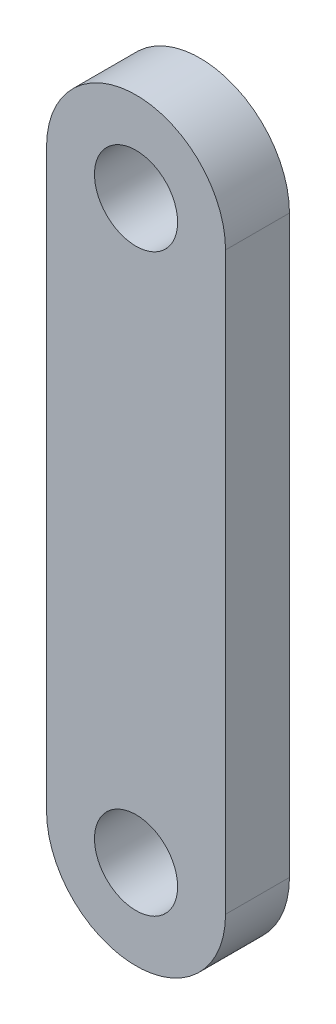
ISO-10303-21;
HEADER;
FILE_DESCRIPTION(('STEP AP214'),'2;1');
FILE_NAME('part.step','',(''),(''),'','','');
FILE_SCHEMA(('AUTOMOTIVE_DESIGN { 1 0 10303 214 1 1 1 1 }'));
ENDSEC;
DATA;
#1=APPLICATION_CONTEXT('core data for automotive mechanical design processes');
#2=APPLICATION_PROTOCOL_DEFINITION('international standard','automotive_design',2000,#1);
#3=PRODUCT_CONTEXT('',#1,'mechanical');
#4=PRODUCT('Part','Part','',(#3));
#5=PRODUCT_RELATED_PRODUCT_CATEGORY('part','',(#4));
#6=PRODUCT_DEFINITION_FORMATION('','',#4);
#7=PRODUCT_DEFINITION_CONTEXT('part definition',#1,'design');
#8=PRODUCT_DEFINITION('design','',#6,#7);
#9=PRODUCT_DEFINITION_SHAPE('','',#8);
#10=(LENGTH_UNIT() NAMED_UNIT(*) SI_UNIT(.MILLI.,.METRE.));
#11=(NAMED_UNIT(*) PLANE_ANGLE_UNIT() SI_UNIT($,.RADIAN.));
#12=(NAMED_UNIT(*) SI_UNIT($,.STERADIAN.) SOLID_ANGLE_UNIT());
#13=UNCERTAINTY_MEASURE_WITH_UNIT(LENGTH_MEASURE(1.E-05),#10,'distance_accuracy_value','');
#14=(GEOMETRIC_REPRESENTATION_CONTEXT(3) GLOBAL_UNCERTAINTY_ASSIGNED_CONTEXT((#13)) GLOBAL_UNIT_ASSIGNED_CONTEXT((#10,
#11,#12)) REPRESENTATION_CONTEXT('',''));
#15=CARTESIAN_POINT('',(0.,0.,0.));
#16=DIRECTION('',(0.,0.,1.));
#17=DIRECTION('',(1.,0.,0.));
#18=AXIS2_PLACEMENT_3D('',#15,#16,#17);
#19=CARTESIAN_POINT('',(0.,-39.0716316858497,5.));
#20=DIRECTION('',(0.,0.,-1.));
#21=DIRECTION('',(-1.,0.,0.));
#22=AXIS2_PLACEMENT_3D('',#19,#20,#21);
#23=CYLINDRICAL_SURFACE('',#22,7.);
#24=CARTESIAN_POINT('',(0.,-39.0716316858497,0.));
#25=DIRECTION('',(0.,0.,1.));
#26=DIRECTION('',(1.,0.,0.));
#27=AXIS2_PLACEMENT_3D('',#24,#25,#26);
#28=CIRCLE('',#27,7.);
#29=CARTESIAN_POINT('',(-7.,-39.0716316858497,0.));
#30=VERTEX_POINT('',#29);
#31=CARTESIAN_POINT('',(7.,-39.0716316858497,0.));
#32=VERTEX_POINT('',#31);
#33=EDGE_CURVE('E111',#30,#32,#28,.T.);
#34=ORIENTED_EDGE('',*,*,#33,.T.);
#35=DIRECTION('',(0.,0.,-1.));
#36=VECTOR('',#35,1.);
#37=CARTESIAN_POINT('',(7.,-39.0716316858497,5.));
#38=LINE('',#37,#36);
#39=CARTESIAN_POINT('',(7.,-39.0716316858497,5.));
#40=VERTEX_POINT('',#39);
#41=EDGE_CURVE('E11',#40,#32,#38,.T.);
#42=ORIENTED_EDGE('',*,*,#41,.F.);
#43=CARTESIAN_POINT('',(0.,-39.0716316858497,5.));
#44=DIRECTION('',(0.,0.,1.));
#45=DIRECTION('',(1.,0.,0.));
#46=AXIS2_PLACEMENT_3D('',#43,#44,#45);
#47=CIRCLE('',#46,7.);
#48=CARTESIAN_POINT('',(-7.,-39.0716316858497,5.));
#49=VERTEX_POINT('',#48);
#50=EDGE_CURVE('E100',#49,#40,#47,.T.);
#51=ORIENTED_EDGE('',*,*,#50,.F.);
#52=DIRECTION('',(0.,0.,-1.));
#53=VECTOR('',#52,1.);
#54=CARTESIAN_POINT('',(-7.,-39.0716316858497,5.));
#55=LINE('',#54,#53);
#56=EDGE_CURVE('E109',#49,#30,#55,.T.);
#57=ORIENTED_EDGE('',*,*,#56,.T.);
#58=EDGE_LOOP('',(#34,#42,#51,#57));
#59=FACE_BOUND('',#58,.T.);
#60=ADVANCED_FACE('F44',(#59),#23,.T.);
#61=CARTESIAN_POINT('',(7.,-39.0716316858497,5.));
#62=DIRECTION('',(-1.,0.,0.));
#63=DIRECTION('',(0.,0.,1.));
#64=AXIS2_PLACEMENT_3D('',#61,#62,#63);
#65=PLANE('',#64);
#66=DIRECTION('',(0.,1.,0.));
#67=VECTOR('',#66,1.);
#68=CARTESIAN_POINT('',(7.,-39.0716316858497,0.));
#69=LINE('',#68,#67);
#70=CARTESIAN_POINT('',(7.,5.92836831415031,0.));
#71=VERTEX_POINT('',#70);
#72=EDGE_CURVE('E105',#32,#71,#69,.T.);
#73=ORIENTED_EDGE('',*,*,#72,.T.);
#74=DIRECTION('',(0.,0.,-1.));
#75=VECTOR('',#74,1.);
#76=CARTESIAN_POINT('',(7.,5.92836831415031,5.));
#77=LINE('',#76,#75);
#78=CARTESIAN_POINT('',(7.,5.92836831415031,5.));
#79=VERTEX_POINT('',#78);
#80=EDGE_CURVE('E53',#79,#71,#77,.T.);
#81=ORIENTED_EDGE('',*,*,#80,.F.);
#82=DIRECTION('',(0.,1.,0.));
#83=VECTOR('',#82,1.);
#84=CARTESIAN_POINT('',(7.,-39.0716316858497,5.));
#85=LINE('',#84,#83);
#86=EDGE_CURVE('E95',#40,#79,#85,.T.);
#87=ORIENTED_EDGE('',*,*,#86,.F.);
#88=ORIENTED_EDGE('',*,*,#41,.T.);
#89=EDGE_LOOP('',(#73,#81,#87,#88));
#90=FACE_BOUND('',#89,.T.);
#91=ADVANCED_FACE('F102',(#90),#65,.F.);
#92=CARTESIAN_POINT('',(0.,5.92836831415031,5.));
#93=DIRECTION('',(0.,0.,-1.));
#94=DIRECTION('',(-1.,0.,0.));
#95=AXIS2_PLACEMENT_3D('',#92,#93,#94);
#96=CYLINDRICAL_SURFACE('',#95,7.);
#97=CARTESIAN_POINT('',(0.,5.92836831415031,0.));
#98=DIRECTION('',(0.,0.,1.));
#99=DIRECTION('',(1.,0.,0.));
#100=AXIS2_PLACEMENT_3D('',#97,#98,#99);
#101=CIRCLE('',#100,7.);
#102=CARTESIAN_POINT('',(-7.,5.92836831415031,0.));
#103=VERTEX_POINT('',#102);
#104=EDGE_CURVE('E80',#71,#103,#101,.T.);
#105=ORIENTED_EDGE('',*,*,#104,.T.);
#106=DIRECTION('',(0.,0.,-1.));
#107=VECTOR('',#106,1.);
#108=CARTESIAN_POINT('',(-7.,5.92836831415031,5.));
#109=LINE('',#108,#107);
#110=CARTESIAN_POINT('',(-7.,5.92836831415031,5.));
#111=VERTEX_POINT('',#110);
#112=EDGE_CURVE('E101',#111,#103,#109,.T.);
#113=ORIENTED_EDGE('',*,*,#112,.F.);
#114=CARTESIAN_POINT('',(0.,5.92836831415031,5.));
#115=DIRECTION('',(0.,0.,1.));
#116=DIRECTION('',(1.,0.,0.));
#117=AXIS2_PLACEMENT_3D('',#114,#115,#116);
#118=CIRCLE('',#117,7.);
#119=EDGE_CURVE('E94',#79,#111,#118,.T.);
#120=ORIENTED_EDGE('',*,*,#119,.F.);
#121=ORIENTED_EDGE('',*,*,#80,.T.);
#122=EDGE_LOOP('',(#105,#113,#120,#121));
#123=FACE_BOUND('',#122,.T.);
#124=ADVANCED_FACE('F103',(#123),#96,.T.);
#125=CARTESIAN_POINT('',(-7.,-39.0716316858497,5.));
#126=DIRECTION('',(1.,0.,0.));
#127=DIRECTION('',(0.,0.,-1.));
#128=AXIS2_PLACEMENT_3D('',#125,#126,#127);
#129=PLANE('',#128);
#130=DIRECTION('',(0.,-1.,0.));
#131=VECTOR('',#130,1.);
#132=CARTESIAN_POINT('',(-7.,-39.0716316858497,0.));
#133=LINE('',#132,#131);
#134=EDGE_CURVE('E82',#103,#30,#133,.T.);
#135=ORIENTED_EDGE('',*,*,#134,.T.);
#136=ORIENTED_EDGE('',*,*,#56,.F.);
#137=DIRECTION('',(0.,-1.,0.));
#138=VECTOR('',#137,1.);
#139=CARTESIAN_POINT('',(-7.,-39.0716316858497,5.));
#140=LINE('',#139,#138);
#141=EDGE_CURVE('E65',#111,#49,#140,.T.);
#142=ORIENTED_EDGE('',*,*,#141,.F.);
#143=ORIENTED_EDGE('',*,*,#112,.T.);
#144=EDGE_LOOP('',(#135,#136,#142,#143));
#145=FACE_BOUND('',#144,.T.);
#146=ADVANCED_FACE('F130',(#145),#129,.F.);
#147=CARTESIAN_POINT('',(0.,-39.0716316858497,5.));
#148=DIRECTION('',(0.,0.,1.));
#149=DIRECTION('',(1.,0.,0.));
#150=AXIS2_PLACEMENT_3D('',#147,#148,#149);
#151=PLANE('',#150);
#152=CARTESIAN_POINT('',(0.,-39.0716316858497,5.));
#153=DIRECTION('',(0.,0.,1.));
#154=DIRECTION('',(1.,0.,0.));
#155=AXIS2_PLACEMENT_3D('',#152,#153,#154);
#156=CIRCLE('',#155,3.25);
#157=CARTESIAN_POINT('',(3.25,-39.0716316858497,5.));
#158=VERTEX_POINT('',#157);
#159=EDGE_CURVE('E145',#158,#158,#156,.T.);
#160=ORIENTED_EDGE('',*,*,#159,.F.);
#161=EDGE_LOOP('',(#160));
#162=FACE_BOUND('',#161,.T.);
#163=CARTESIAN_POINT('',(0.,5.9283683141503,5.));
#164=DIRECTION('',(0.,0.,1.));
#165=DIRECTION('',(1.,0.,0.));
#166=AXIS2_PLACEMENT_3D('',#163,#164,#165);
#167=CIRCLE('',#166,3.25);
#168=CARTESIAN_POINT('',(3.25,5.9283683141503,5.));
#169=VERTEX_POINT('',#168);
#170=EDGE_CURVE('E138',#169,#169,#167,.T.);
#171=ORIENTED_EDGE('',*,*,#170,.F.);
#172=EDGE_LOOP('',(#171));
#173=FACE_BOUND('',#172,.T.);
#174=ORIENTED_EDGE('',*,*,#50,.T.);
#175=ORIENTED_EDGE('',*,*,#86,.T.);
#176=ORIENTED_EDGE('',*,*,#119,.T.);
#177=ORIENTED_EDGE('',*,*,#141,.T.);
#178=EDGE_LOOP('',(#174,#175,#176,#177));
#179=FACE_BOUND('',#178,.T.);
#180=ADVANCED_FACE('F93',(#162,#173,#179),#151,.T.);
#181=CARTESIAN_POINT('',(0.,-39.0716316858497,0.));
#182=DIRECTION('',(0.,0.,1.));
#183=DIRECTION('',(1.,0.,0.));
#184=AXIS2_PLACEMENT_3D('',#181,#182,#183);
#185=PLANE('',#184);
#186=CARTESIAN_POINT('',(0.,-39.0716316858497,0.));
#187=DIRECTION('',(0.,0.,1.));
#188=DIRECTION('',(1.,0.,0.));
#189=AXIS2_PLACEMENT_3D('',#186,#187,#188);
#190=CIRCLE('',#189,3.25);
#191=CARTESIAN_POINT('',(3.25,-39.0716316858497,0.));
#192=VERTEX_POINT('',#191);
#193=EDGE_CURVE('E120',#192,#192,#190,.T.);
#194=ORIENTED_EDGE('',*,*,#193,.T.);
#195=EDGE_LOOP('',(#194));
#196=FACE_BOUND('',#195,.T.);
#197=CARTESIAN_POINT('',(0.,5.9283683141503,0.));
#198=DIRECTION('',(0.,0.,1.));
#199=DIRECTION('',(1.,0.,0.));
#200=AXIS2_PLACEMENT_3D('',#197,#198,#199);
#201=CIRCLE('',#200,3.25);
#202=CARTESIAN_POINT('',(3.25,5.9283683141503,0.));
#203=VERTEX_POINT('',#202);
#204=EDGE_CURVE('E132',#203,#203,#201,.T.);
#205=ORIENTED_EDGE('',*,*,#204,.T.);
#206=EDGE_LOOP('',(#205));
#207=FACE_BOUND('',#206,.T.);
#208=ORIENTED_EDGE('',*,*,#33,.F.);
#209=ORIENTED_EDGE('',*,*,#134,.F.);
#210=ORIENTED_EDGE('',*,*,#104,.F.);
#211=ORIENTED_EDGE('',*,*,#72,.F.);
#212=EDGE_LOOP('',(#208,#209,#210,#211));
#213=FACE_BOUND('',#212,.T.);
#214=ADVANCED_FACE('F127',(#196,#207,#213),#185,.F.);
#215=CARTESIAN_POINT('',(0.,5.9283683141503,0.));
#216=DIRECTION('',(0.,0.,1.));
#217=DIRECTION('',(1.,0.,0.));
#218=AXIS2_PLACEMENT_3D('',#215,#216,#217);
#219=CYLINDRICAL_SURFACE('',#218,3.25);
#220=ORIENTED_EDGE('',*,*,#204,.F.);
#221=EDGE_LOOP('',(#220));
#222=FACE_BOUND('',#221,.T.);
#223=ORIENTED_EDGE('',*,*,#170,.T.);
#224=EDGE_LOOP('',(#223));
#225=FACE_BOUND('',#224,.T.);
#226=ADVANCED_FACE('F151',(#222,#225),#219,.F.);
#227=CARTESIAN_POINT('',(0.,-39.0716316858497,0.));
#228=DIRECTION('',(0.,0.,1.));
#229=DIRECTION('',(1.,0.,0.));
#230=AXIS2_PLACEMENT_3D('',#227,#228,#229);
#231=CYLINDRICAL_SURFACE('',#230,3.25);
#232=ORIENTED_EDGE('',*,*,#193,.F.);
#233=EDGE_LOOP('',(#232));
#234=FACE_BOUND('',#233,.T.);
#235=ORIENTED_EDGE('',*,*,#159,.T.);
#236=EDGE_LOOP('',(#235));
#237=FACE_BOUND('',#236,.T.);
#238=ADVANCED_FACE('F155',(#234,#237),#231,.F.);
#239=CLOSED_SHELL('',(#60,#91,#124,#146,#180,#214,#226,#238));
#240=MANIFOLD_SOLID_BREP('B2',#239);
#241=ADVANCED_BREP_SHAPE_REPRESENTATION('',(#18,#240),#14);
#242=SHAPE_DEFINITION_REPRESENTATION(#9,#241);
ENDSEC;
END-ISO-10303-21;
